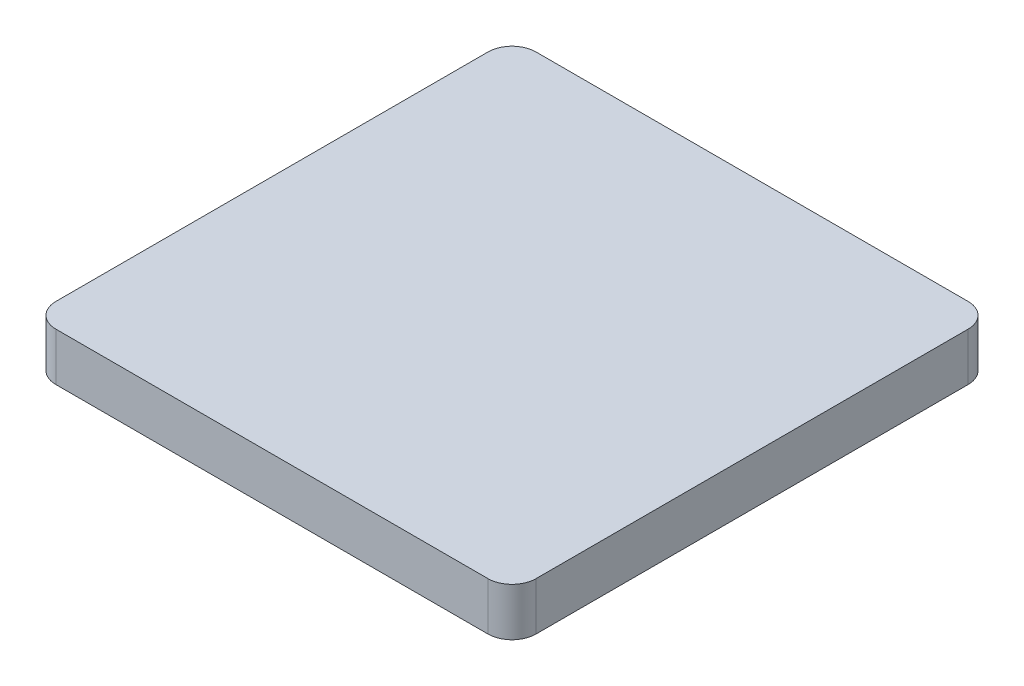
ISO-10303-21;
HEADER;
FILE_DESCRIPTION(('STEP AP214'),'2;1');
FILE_NAME('part.step','',(''),(''),'','','');
FILE_SCHEMA(('AUTOMOTIVE_DESIGN { 1 0 10303 214 1 1 1 1 }'));
ENDSEC;
DATA;
#1=APPLICATION_CONTEXT('core data for automotive mechanical design processes');
#2=APPLICATION_PROTOCOL_DEFINITION('international standard','automotive_design',2000,#1);
#3=PRODUCT_CONTEXT('',#1,'mechanical');
#4=PRODUCT('Part','Part','',(#3));
#5=PRODUCT_RELATED_PRODUCT_CATEGORY('part','',(#4));
#6=PRODUCT_DEFINITION_FORMATION('','',#4);
#7=PRODUCT_DEFINITION_CONTEXT('part definition',#1,'design');
#8=PRODUCT_DEFINITION('design','',#6,#7);
#9=PRODUCT_DEFINITION_SHAPE('','',#8);
#10=(LENGTH_UNIT() NAMED_UNIT(*) SI_UNIT(.MILLI.,.METRE.));
#11=(NAMED_UNIT(*) PLANE_ANGLE_UNIT() SI_UNIT($,.RADIAN.));
#12=(NAMED_UNIT(*) SI_UNIT($,.STERADIAN.) SOLID_ANGLE_UNIT());
#13=UNCERTAINTY_MEASURE_WITH_UNIT(LENGTH_MEASURE(1.E-05),#10,'distance_accuracy_value','');
#14=(GEOMETRIC_REPRESENTATION_CONTEXT(3) GLOBAL_UNCERTAINTY_ASSIGNED_CONTEXT((#13)) GLOBAL_UNIT_ASSIGNED_CONTEXT((#10,
#11,#12)) REPRESENTATION_CONTEXT('',''));
#15=CARTESIAN_POINT('',(0.,0.,0.));
#16=DIRECTION('',(0.,0.,1.));
#17=DIRECTION('',(1.,0.,0.));
#18=AXIS2_PLACEMENT_3D('',#15,#16,#17);
#19=CARTESIAN_POINT('',(-28.575,6.35,-28.575));
#20=DIRECTION('',(0.,-1.,0.));
#21=DIRECTION('',(0.,0.,-1.));
#22=AXIS2_PLACEMENT_3D('',#19,#20,#21);
#23=CYLINDRICAL_SURFACE('',#22,3.175);
#24=CARTESIAN_POINT('',(-28.575,0.,-28.575));
#25=DIRECTION('',(0.,1.,0.));
#26=DIRECTION('',(0.,0.,-1.));
#27=AXIS2_PLACEMENT_3D('',#24,#25,#26);
#28=CIRCLE('',#27,3.175);
#29=CARTESIAN_POINT('',(-28.575,0.,-31.75));
#30=VERTEX_POINT('',#29);
#31=CARTESIAN_POINT('',(-31.75,0.,-28.575));
#32=VERTEX_POINT('',#31);
#33=EDGE_CURVE('E146',#30,#32,#28,.T.);
#34=ORIENTED_EDGE('',*,*,#33,.T.);
#35=DIRECTION('',(0.,-1.,0.));
#36=VECTOR('',#35,1.);
#37=CARTESIAN_POINT('',(-31.75,6.35,-28.575));
#38=LINE('',#37,#36);
#39=CARTESIAN_POINT('',(-31.75,6.35,-28.575));
#40=VERTEX_POINT('',#39);
#41=EDGE_CURVE('E11',#40,#32,#38,.T.);
#42=ORIENTED_EDGE('',*,*,#41,.F.);
#43=CARTESIAN_POINT('',(-28.575,6.35,-28.575));
#44=DIRECTION('',(0.,1.,0.));
#45=DIRECTION('',(0.,0.,-1.));
#46=AXIS2_PLACEMENT_3D('',#43,#44,#45);
#47=CIRCLE('',#46,3.175);
#48=CARTESIAN_POINT('',(-28.575,6.35,-31.75));
#49=VERTEX_POINT('',#48);
#50=EDGE_CURVE('E168',#49,#40,#47,.T.);
#51=ORIENTED_EDGE('',*,*,#50,.F.);
#52=DIRECTION('',(0.,-1.,0.));
#53=VECTOR('',#52,1.);
#54=CARTESIAN_POINT('',(-28.575,6.35,-31.75));
#55=LINE('',#54,#53);
#56=EDGE_CURVE('E142',#49,#30,#55,.T.);
#57=ORIENTED_EDGE('',*,*,#56,.T.);
#58=EDGE_LOOP('',(#34,#42,#51,#57));
#59=FACE_BOUND('',#58,.T.);
#60=ADVANCED_FACE('F45',(#59),#23,.T.);
#61=CARTESIAN_POINT('',(-31.75,6.35,28.575));
#62=DIRECTION('',(1.,0.,0.));
#63=DIRECTION('',(0.,0.,-1.));
#64=AXIS2_PLACEMENT_3D('',#61,#62,#63);
#65=PLANE('',#64);
#66=DIRECTION('',(0.,0.,1.));
#67=VECTOR('',#66,1.);
#68=CARTESIAN_POINT('',(-31.75,0.,28.575));
#69=LINE('',#68,#67);
#70=CARTESIAN_POINT('',(-31.75,0.,28.575));
#71=VERTEX_POINT('',#70);
#72=EDGE_CURVE('E150',#32,#71,#69,.T.);
#73=ORIENTED_EDGE('',*,*,#72,.T.);
#74=DIRECTION('',(0.,-1.,0.));
#75=VECTOR('',#74,1.);
#76=CARTESIAN_POINT('',(-31.75,6.35,28.575));
#77=LINE('',#76,#75);
#78=CARTESIAN_POINT('',(-31.75,6.35,28.575));
#79=VERTEX_POINT('',#78);
#80=EDGE_CURVE('E54',#79,#71,#77,.T.);
#81=ORIENTED_EDGE('',*,*,#80,.F.);
#82=DIRECTION('',(0.,0.,1.));
#83=VECTOR('',#82,1.);
#84=CARTESIAN_POINT('',(-31.75,6.35,28.575));
#85=LINE('',#84,#83);
#86=EDGE_CURVE('E105',#40,#79,#85,.T.);
#87=ORIENTED_EDGE('',*,*,#86,.F.);
#88=ORIENTED_EDGE('',*,*,#41,.T.);
#89=EDGE_LOOP('',(#73,#81,#87,#88));
#90=FACE_BOUND('',#89,.T.);
#91=ADVANCED_FACE('F214',(#90),#65,.F.);
#92=CARTESIAN_POINT('',(-28.575,6.35,28.575));
#93=DIRECTION('',(0.,-1.,0.));
#94=DIRECTION('',(0.,0.,-1.));
#95=AXIS2_PLACEMENT_3D('',#92,#93,#94);
#96=CYLINDRICAL_SURFACE('',#95,3.175);
#97=CARTESIAN_POINT('',(-28.575,0.,28.575));
#98=DIRECTION('',(0.,1.,0.));
#99=DIRECTION('',(0.,0.,-1.));
#100=AXIS2_PLACEMENT_3D('',#97,#98,#99);
#101=CIRCLE('',#100,3.175);
#102=CARTESIAN_POINT('',(-28.575,0.,31.75));
#103=VERTEX_POINT('',#102);
#104=EDGE_CURVE('E153',#71,#103,#101,.T.);
#105=ORIENTED_EDGE('',*,*,#104,.T.);
#106=DIRECTION('',(0.,-1.,0.));
#107=VECTOR('',#106,1.);
#108=CARTESIAN_POINT('',(-28.575,6.35,31.75));
#109=LINE('',#108,#107);
#110=CARTESIAN_POINT('',(-28.575,6.35,31.75));
#111=VERTEX_POINT('',#110);
#112=EDGE_CURVE('E179',#111,#103,#109,.T.);
#113=ORIENTED_EDGE('',*,*,#112,.F.);
#114=CARTESIAN_POINT('',(-28.575,6.35,28.575));
#115=DIRECTION('',(0.,1.,0.));
#116=DIRECTION('',(0.,0.,-1.));
#117=AXIS2_PLACEMENT_3D('',#114,#115,#116);
#118=CIRCLE('',#117,3.175);
#119=EDGE_CURVE('E189',#79,#111,#118,.T.);
#120=ORIENTED_EDGE('',*,*,#119,.F.);
#121=ORIENTED_EDGE('',*,*,#80,.T.);
#122=EDGE_LOOP('',(#105,#113,#120,#121));
#123=FACE_BOUND('',#122,.T.);
#124=ADVANCED_FACE('F187',(#123),#96,.T.);
#125=CARTESIAN_POINT('',(-28.575,6.35,31.75));
#126=DIRECTION('',(0.,0.,-1.));
#127=DIRECTION('',(-1.,0.,0.));
#128=AXIS2_PLACEMENT_3D('',#125,#126,#127);
#129=PLANE('',#128);
#130=DIRECTION('',(1.,0.,0.));
#131=VECTOR('',#130,1.);
#132=CARTESIAN_POINT('',(-28.575,0.,31.75));
#133=LINE('',#132,#131);
#134=CARTESIAN_POINT('',(28.575,0.,31.75));
#135=VERTEX_POINT('',#134);
#136=EDGE_CURVE('E156',#103,#135,#133,.T.);
#137=ORIENTED_EDGE('',*,*,#136,.T.);
#138=DIRECTION('',(0.,-1.,0.));
#139=VECTOR('',#138,1.);
#140=CARTESIAN_POINT('',(28.575,6.35,31.75));
#141=LINE('',#140,#139);
#142=CARTESIAN_POINT('',(28.575,6.35,31.75));
#143=VERTEX_POINT('',#142);
#144=EDGE_CURVE('E175',#143,#135,#141,.T.);
#145=ORIENTED_EDGE('',*,*,#144,.F.);
#146=DIRECTION('',(1.,0.,0.));
#147=VECTOR('',#146,1.);
#148=CARTESIAN_POINT('',(-28.575,6.35,31.75));
#149=LINE('',#148,#147);
#150=EDGE_CURVE('E202',#111,#143,#149,.T.);
#151=ORIENTED_EDGE('',*,*,#150,.F.);
#152=ORIENTED_EDGE('',*,*,#112,.T.);
#153=EDGE_LOOP('',(#137,#145,#151,#152));
#154=FACE_BOUND('',#153,.T.);
#155=ADVANCED_FACE('F197',(#154),#129,.F.);
#156=CARTESIAN_POINT('',(28.575,6.35,28.575));
#157=DIRECTION('',(0.,-1.,0.));
#158=DIRECTION('',(0.,0.,-1.));
#159=AXIS2_PLACEMENT_3D('',#156,#157,#158);
#160=CYLINDRICAL_SURFACE('',#159,3.175);
#161=CARTESIAN_POINT('',(28.575,0.,28.575));
#162=DIRECTION('',(0.,1.,0.));
#163=DIRECTION('',(0.,0.,1.));
#164=AXIS2_PLACEMENT_3D('',#161,#162,#163);
#165=CIRCLE('',#164,3.175);
#166=CARTESIAN_POINT('',(31.75,0.,28.575));
#167=VERTEX_POINT('',#166);
#168=EDGE_CURVE('E159',#135,#167,#165,.T.);
#169=ORIENTED_EDGE('',*,*,#168,.T.);
#170=DIRECTION('',(0.,-1.,0.));
#171=VECTOR('',#170,1.);
#172=CARTESIAN_POINT('',(31.75,6.35,28.575));
#173=LINE('',#172,#171);
#174=CARTESIAN_POINT('',(31.75,6.35,28.575));
#175=VERTEX_POINT('',#174);
#176=EDGE_CURVE('E135',#175,#167,#173,.T.);
#177=ORIENTED_EDGE('',*,*,#176,.F.);
#178=CARTESIAN_POINT('',(28.575,6.35,28.575));
#179=DIRECTION('',(0.,1.,0.));
#180=DIRECTION('',(0.,0.,1.));
#181=AXIS2_PLACEMENT_3D('',#178,#179,#180);
#182=CIRCLE('',#181,3.175);
#183=EDGE_CURVE('E124',#143,#175,#182,.T.);
#184=ORIENTED_EDGE('',*,*,#183,.F.);
#185=ORIENTED_EDGE('',*,*,#144,.T.);
#186=EDGE_LOOP('',(#169,#177,#184,#185));
#187=FACE_BOUND('',#186,.T.);
#188=ADVANCED_FACE('F200',(#187),#160,.T.);
#189=CARTESIAN_POINT('',(31.75,6.35,28.575));
#190=DIRECTION('',(-1.,0.,0.));
#191=DIRECTION('',(0.,0.,1.));
#192=AXIS2_PLACEMENT_3D('',#189,#190,#191);
#193=PLANE('',#192);
#194=DIRECTION('',(0.,0.,-1.));
#195=VECTOR('',#194,1.);
#196=CARTESIAN_POINT('',(31.75,0.,28.575));
#197=LINE('',#196,#195);
#198=CARTESIAN_POINT('',(31.75,0.,-28.575));
#199=VERTEX_POINT('',#198);
#200=EDGE_CURVE('E133',#167,#199,#197,.T.);
#201=ORIENTED_EDGE('',*,*,#200,.T.);
#202=DIRECTION('',(0.,-1.,0.));
#203=VECTOR('',#202,1.);
#204=CARTESIAN_POINT('',(31.75,6.35,-28.575));
#205=LINE('',#204,#203);
#206=CARTESIAN_POINT('',(31.75,6.35,-28.575));
#207=VERTEX_POINT('',#206);
#208=EDGE_CURVE('E130',#207,#199,#205,.T.);
#209=ORIENTED_EDGE('',*,*,#208,.F.);
#210=DIRECTION('',(0.,0.,-1.));
#211=VECTOR('',#210,1.);
#212=CARTESIAN_POINT('',(31.75,6.35,28.575));
#213=LINE('',#212,#211);
#214=EDGE_CURVE('E118',#175,#207,#213,.T.);
#215=ORIENTED_EDGE('',*,*,#214,.F.);
#216=ORIENTED_EDGE('',*,*,#176,.T.);
#217=EDGE_LOOP('',(#201,#209,#215,#216));
#218=FACE_BOUND('',#217,.T.);
#219=ADVANCED_FACE('F131',(#218),#193,.F.);
#220=CARTESIAN_POINT('',(28.575,6.35,-28.575));
#221=DIRECTION('',(0.,-1.,0.));
#222=DIRECTION('',(0.,0.,-1.));
#223=AXIS2_PLACEMENT_3D('',#220,#221,#222);
#224=CYLINDRICAL_SURFACE('',#223,3.175);
#225=CARTESIAN_POINT('',(28.575,0.,-28.575));
#226=DIRECTION('',(0.,1.,0.));
#227=DIRECTION('',(0.,0.,-1.));
#228=AXIS2_PLACEMENT_3D('',#225,#226,#227);
#229=CIRCLE('',#228,3.175);
#230=CARTESIAN_POINT('',(28.575,0.,-31.75));
#231=VERTEX_POINT('',#230);
#232=EDGE_CURVE('E91',#199,#231,#229,.T.);
#233=ORIENTED_EDGE('',*,*,#232,.T.);
#234=DIRECTION('',(0.,-1.,0.));
#235=VECTOR('',#234,1.);
#236=CARTESIAN_POINT('',(28.575,6.35,-31.75));
#237=LINE('',#236,#235);
#238=CARTESIAN_POINT('',(28.575,6.35,-31.75));
#239=VERTEX_POINT('',#238);
#240=EDGE_CURVE('E136',#239,#231,#237,.T.);
#241=ORIENTED_EDGE('',*,*,#240,.F.);
#242=CARTESIAN_POINT('',(28.575,6.35,-28.575));
#243=DIRECTION('',(0.,1.,0.));
#244=DIRECTION('',(0.,0.,-1.));
#245=AXIS2_PLACEMENT_3D('',#242,#243,#244);
#246=CIRCLE('',#245,3.175);
#247=EDGE_CURVE('E122',#207,#239,#246,.T.);
#248=ORIENTED_EDGE('',*,*,#247,.F.);
#249=ORIENTED_EDGE('',*,*,#208,.T.);
#250=EDGE_LOOP('',(#233,#241,#248,#249));
#251=FACE_BOUND('',#250,.T.);
#252=ADVANCED_FACE('F138',(#251),#224,.T.);
#253=CARTESIAN_POINT('',(-28.575,6.35,-31.75));
#254=DIRECTION('',(0.,0.,1.));
#255=DIRECTION('',(1.,0.,0.));
#256=AXIS2_PLACEMENT_3D('',#253,#254,#255);
#257=PLANE('',#256);
#258=DIRECTION('',(-1.,0.,0.));
#259=VECTOR('',#258,1.);
#260=CARTESIAN_POINT('',(-28.575,0.,-31.75));
#261=LINE('',#260,#259);
#262=EDGE_CURVE('E97',#231,#30,#261,.T.);
#263=ORIENTED_EDGE('',*,*,#262,.T.);
#264=ORIENTED_EDGE('',*,*,#56,.F.);
#265=DIRECTION('',(-1.,0.,0.));
#266=VECTOR('',#265,1.);
#267=CARTESIAN_POINT('',(-28.575,6.35,-31.75));
#268=LINE('',#267,#266);
#269=EDGE_CURVE('E62',#239,#49,#268,.T.);
#270=ORIENTED_EDGE('',*,*,#269,.F.);
#271=ORIENTED_EDGE('',*,*,#240,.T.);
#272=EDGE_LOOP('',(#263,#264,#270,#271));
#273=FACE_BOUND('',#272,.T.);
#274=ADVANCED_FACE('F230',(#273),#257,.F.);
#275=CARTESIAN_POINT('',(-28.575,6.35,-28.575));
#276=DIRECTION('',(0.,-1.,0.));
#277=DIRECTION('',(0.,0.,-1.));
#278=AXIS2_PLACEMENT_3D('',#275,#276,#277);
#279=PLANE('',#278);
#280=ORIENTED_EDGE('',*,*,#50,.T.);
#281=ORIENTED_EDGE('',*,*,#86,.T.);
#282=ORIENTED_EDGE('',*,*,#119,.T.);
#283=ORIENTED_EDGE('',*,*,#150,.T.);
#284=ORIENTED_EDGE('',*,*,#183,.T.);
#285=ORIENTED_EDGE('',*,*,#214,.T.);
#286=ORIENTED_EDGE('',*,*,#247,.T.);
#287=ORIENTED_EDGE('',*,*,#269,.T.);
#288=EDGE_LOOP('',(#280,#281,#282,#283,#284,#285,#286,#287));
#289=FACE_BOUND('',#288,.T.);
#290=ADVANCED_FACE('F120',(#289),#279,.F.);
#291=CARTESIAN_POINT('',(-28.575,0.,-28.575));
#292=DIRECTION('',(0.,-1.,0.));
#293=DIRECTION('',(0.,0.,-1.));
#294=AXIS2_PLACEMENT_3D('',#291,#292,#293);
#295=PLANE('',#294);
#296=ORIENTED_EDGE('',*,*,#33,.F.);
#297=ORIENTED_EDGE('',*,*,#262,.F.);
#298=ORIENTED_EDGE('',*,*,#232,.F.);
#299=ORIENTED_EDGE('',*,*,#200,.F.);
#300=ORIENTED_EDGE('',*,*,#168,.F.);
#301=ORIENTED_EDGE('',*,*,#136,.F.);
#302=ORIENTED_EDGE('',*,*,#104,.F.);
#303=ORIENTED_EDGE('',*,*,#72,.F.);
#304=EDGE_LOOP('',(#296,#297,#298,#299,#300,#301,#302,#303));
#305=FACE_BOUND('',#304,.T.);
#306=ADVANCED_FACE('F193',(#305),#295,.T.);
#307=CLOSED_SHELL('',(#60,#91,#124,#155,#188,#219,#252,#274,#290,#306));
#308=MANIFOLD_SOLID_BREP('B2',#307);
#309=ADVANCED_BREP_SHAPE_REPRESENTATION('',(#18,#308),#14);
#310=SHAPE_DEFINITION_REPRESENTATION(#9,#309);
ENDSEC;
END-ISO-10303-21;
